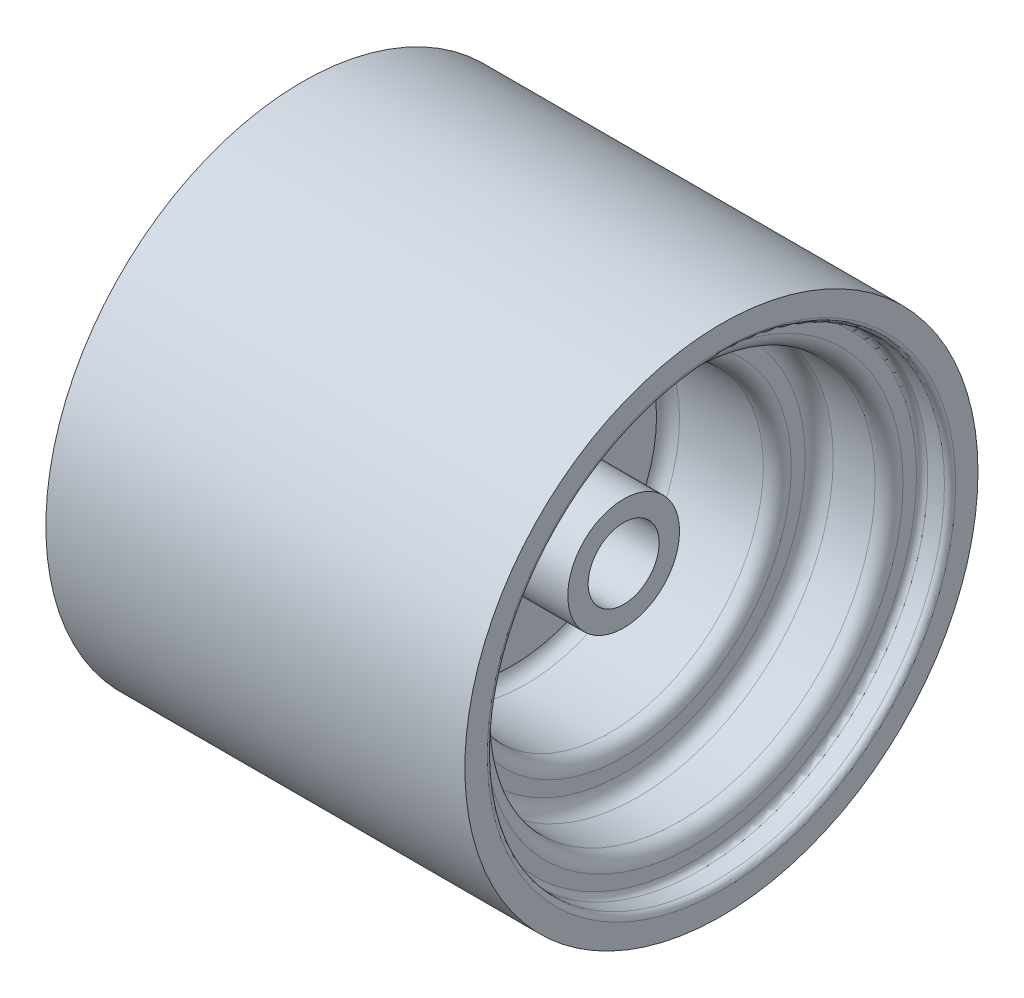
ISO-10303-21;
HEADER;
FILE_DESCRIPTION(('STEP AP214'),'2;1');
FILE_NAME('part.step','',(''),(''),'','','');
FILE_SCHEMA(('AUTOMOTIVE_DESIGN { 1 0 10303 214 1 1 1 1 }'));
ENDSEC;
DATA;
#1=APPLICATION_CONTEXT('core data for automotive mechanical design processes');
#2=APPLICATION_PROTOCOL_DEFINITION('international standard','automotive_design',2000,#1);
#3=PRODUCT_CONTEXT('',#1,'mechanical');
#4=PRODUCT('Part','Part','',(#3));
#5=PRODUCT_RELATED_PRODUCT_CATEGORY('part','',(#4));
#6=PRODUCT_DEFINITION_FORMATION('','',#4);
#7=PRODUCT_DEFINITION_CONTEXT('part definition',#1,'design');
#8=PRODUCT_DEFINITION('design','',#6,#7);
#9=PRODUCT_DEFINITION_SHAPE('','',#8);
#10=(LENGTH_UNIT() NAMED_UNIT(*) SI_UNIT(.MILLI.,.METRE.));
#11=(NAMED_UNIT(*) PLANE_ANGLE_UNIT() SI_UNIT($,.RADIAN.));
#12=(NAMED_UNIT(*) SI_UNIT($,.STERADIAN.) SOLID_ANGLE_UNIT());
#13=UNCERTAINTY_MEASURE_WITH_UNIT(LENGTH_MEASURE(1.E-05),#10,'distance_accuracy_value','');
#14=(GEOMETRIC_REPRESENTATION_CONTEXT(3) GLOBAL_UNCERTAINTY_ASSIGNED_CONTEXT((#13)) GLOBAL_UNIT_ASSIGNED_CONTEXT((#10,
#11,#12)) REPRESENTATION_CONTEXT('',''));
#15=CARTESIAN_POINT('',(0.,0.,0.));
#16=DIRECTION('',(0.,0.,1.));
#17=DIRECTION('',(1.,0.,0.));
#18=AXIS2_PLACEMENT_3D('',#15,#16,#17);
#19=CARTESIAN_POINT('',(150.24,0.,0.));
#20=DIRECTION('',(-1.,0.,0.));
#21=DIRECTION('',(0.,0.,1.));
#22=AXIS2_PLACEMENT_3D('',#19,#20,#21);
#23=CYLINDRICAL_SURFACE('',#22,91.845);
#24=CARTESIAN_POINT('',(150.24,0.,0.));
#25=DIRECTION('',(1.,0.,0.));
#26=DIRECTION('',(0.,0.,-1.));
#27=AXIS2_PLACEMENT_3D('',#24,#25,#26);
#28=CIRCLE('',#27,91.845);
#29=CARTESIAN_POINT('',(150.24,0.,-91.845));
#30=VERTEX_POINT('',#29);
#31=EDGE_CURVE('E75',#30,#30,#28,.T.);
#32=ORIENTED_EDGE('',*,*,#31,.F.);
#33=EDGE_LOOP('',(#32));
#34=FACE_BOUND('',#33,.T.);
#35=CARTESIAN_POINT('',(0.239999999999962,0.,0.));
#36=DIRECTION('',(1.,0.,0.));
#37=DIRECTION('',(0.,0.,-1.));
#38=AXIS2_PLACEMENT_3D('',#35,#36,#37);
#39=CIRCLE('',#38,91.845);
#40=CARTESIAN_POINT('',(0.239999999999962,0.,-91.845));
#41=VERTEX_POINT('',#40);
#42=EDGE_CURVE('E132',#41,#41,#39,.T.);
#43=ORIENTED_EDGE('',*,*,#42,.T.);
#44=EDGE_LOOP('',(#43));
#45=FACE_BOUND('',#44,.T.);
#46=ADVANCED_FACE('F31',(#34,#45),#23,.T.);
#47=CARTESIAN_POINT('',(150.24,0.,0.));
#48=DIRECTION('',(1.,0.,0.));
#49=DIRECTION('',(0.,0.,-1.));
#50=AXIS2_PLACEMENT_3D('',#47,#48,#49);
#51=PLANE('',#50);
#52=CARTESIAN_POINT('',(150.24,0.,0.));
#53=DIRECTION('',(1.,0.,0.));
#54=DIRECTION('',(0.,0.,-1.));
#55=AXIS2_PLACEMENT_3D('',#52,#53,#54);
#56=CIRCLE('',#55,83.845);
#57=CARTESIAN_POINT('',(150.24,0.,-83.845));
#58=VERTEX_POINT('',#57);
#59=EDGE_CURVE('E69',#58,#58,#56,.F.);
#60=ORIENTED_EDGE('',*,*,#59,.T.);
#61=EDGE_LOOP('',(#60));
#62=FACE_BOUND('',#61,.T.);
#63=ORIENTED_EDGE('',*,*,#31,.T.);
#64=EDGE_LOOP('',(#63));
#65=FACE_BOUND('',#64,.T.);
#66=ADVANCED_FACE('F164',(#62,#65),#51,.T.);
#67=CARTESIAN_POINT('',(140.24,0.,0.));
#68=DIRECTION('',(1.,0.,0.));
#69=DIRECTION('',(0.,0.,-1.));
#70=AXIS2_PLACEMENT_3D('',#67,#68,#69);
#71=CYLINDRICAL_SURFACE('',#70,81.845);
#72=CARTESIAN_POINT('',(142.24,0.,0.));
#73=DIRECTION('',(1.,0.,0.));
#74=DIRECTION('',(0.,0.,-1.));
#75=AXIS2_PLACEMENT_3D('',#72,#73,#74);
#76=CIRCLE('',#75,81.845);
#77=CARTESIAN_POINT('',(142.24,0.,-81.845));
#78=VERTEX_POINT('',#77);
#79=EDGE_CURVE('E51',#78,#78,#76,.F.);
#80=ORIENTED_EDGE('',*,*,#79,.T.);
#81=EDGE_LOOP('',(#80));
#82=FACE_BOUND('',#81,.T.);
#83=CARTESIAN_POINT('',(148.24,0.,0.));
#84=DIRECTION('',(1.,0.,0.));
#85=DIRECTION('',(0.,0.,-1.));
#86=AXIS2_PLACEMENT_3D('',#83,#84,#85);
#87=CIRCLE('',#86,81.845);
#88=CARTESIAN_POINT('',(148.24,0.,-81.845));
#89=VERTEX_POINT('',#88);
#90=EDGE_CURVE('E72',#89,#89,#87,.T.);
#91=ORIENTED_EDGE('',*,*,#90,.T.);
#92=EDGE_LOOP('',(#91));
#93=FACE_BOUND('',#92,.T.);
#94=ADVANCED_FACE('F170',(#82,#93),#71,.F.);
#95=CARTESIAN_POINT('',(140.24,0.,0.));
#96=DIRECTION('',(1.,0.,0.));
#97=DIRECTION('',(0.,0.,-1.));
#98=AXIS2_PLACEMENT_3D('',#95,#96,#97);
#99=PLANE('',#98);
#100=CARTESIAN_POINT('',(140.24,0.,0.));
#101=DIRECTION('',(1.,0.,0.));
#102=DIRECTION('',(0.,0.,-1.));
#103=AXIS2_PLACEMENT_3D('',#100,#101,#102);
#104=CIRCLE('',#103,79.845);
#105=CARTESIAN_POINT('',(140.24,0.,-79.845));
#106=VERTEX_POINT('',#105);
#107=EDGE_CURVE('E54',#106,#106,#104,.T.);
#108=ORIENTED_EDGE('',*,*,#107,.T.);
#109=EDGE_LOOP('',(#108));
#110=FACE_BOUND('',#109,.T.);
#111=CARTESIAN_POINT('',(140.24,0.,0.));
#112=DIRECTION('',(1.,0.,0.));
#113=DIRECTION('',(0.,0.,-1.));
#114=AXIS2_PLACEMENT_3D('',#111,#112,#113);
#115=CIRCLE('',#114,75.);
#116=CARTESIAN_POINT('',(140.24,0.,-75.));
#117=VERTEX_POINT('',#116);
#118=EDGE_CURVE('E63',#117,#117,#115,.F.);
#119=ORIENTED_EDGE('',*,*,#118,.T.);
#120=EDGE_LOOP('',(#119));
#121=FACE_BOUND('',#120,.T.);
#122=ADVANCED_FACE('F295',(#110,#121),#99,.T.);
#123=CARTESIAN_POINT('',(115.24,0.,0.));
#124=DIRECTION('',(1.,0.,0.));
#125=DIRECTION('',(0.,0.,-1.));
#126=AXIS2_PLACEMENT_3D('',#123,#124,#125);
#127=CYLINDRICAL_SURFACE('',#126,70.);
#128=CARTESIAN_POINT('',(120.24,0.,0.));
#129=DIRECTION('',(1.,0.,0.));
#130=DIRECTION('',(0.,0.,-1.));
#131=AXIS2_PLACEMENT_3D('',#128,#129,#130);
#132=CIRCLE('',#131,70.);
#133=CARTESIAN_POINT('',(120.24,0.,-70.));
#134=VERTEX_POINT('',#133);
#135=EDGE_CURVE('E57',#134,#134,#132,.F.);
#136=ORIENTED_EDGE('',*,*,#135,.T.);
#137=EDGE_LOOP('',(#136));
#138=FACE_BOUND('',#137,.T.);
#139=CARTESIAN_POINT('',(135.24,0.,0.));
#140=DIRECTION('',(1.,0.,0.));
#141=DIRECTION('',(0.,0.,-1.));
#142=AXIS2_PLACEMENT_3D('',#139,#140,#141);
#143=CIRCLE('',#142,70.);
#144=CARTESIAN_POINT('',(135.24,0.,-70.));
#145=VERTEX_POINT('',#144);
#146=EDGE_CURVE('E66',#145,#145,#143,.T.);
#147=ORIENTED_EDGE('',*,*,#146,.T.);
#148=EDGE_LOOP('',(#147));
#149=FACE_BOUND('',#148,.T.);
#150=ADVANCED_FACE('F291',(#138,#149),#127,.F.);
#151=CARTESIAN_POINT('',(115.24,0.,0.));
#152=DIRECTION('',(1.,0.,0.));
#153=DIRECTION('',(0.,0.,-1.));
#154=AXIS2_PLACEMENT_3D('',#151,#152,#153);
#155=PLANE('',#154);
#156=CARTESIAN_POINT('',(115.24,0.,0.));
#157=DIRECTION('',(1.,0.,0.));
#158=DIRECTION('',(0.,0.,-1.));
#159=AXIS2_PLACEMENT_3D('',#156,#157,#158);
#160=CIRCLE('',#159,60.);
#161=CARTESIAN_POINT('',(115.24,0.,-60.));
#162=VERTEX_POINT('',#161);
#163=EDGE_CURVE('E42',#162,#162,#160,.F.);
#164=ORIENTED_EDGE('',*,*,#163,.T.);
#165=EDGE_LOOP('',(#164));
#166=FACE_BOUND('',#165,.T.);
#167=CARTESIAN_POINT('',(115.24,0.,0.));
#168=DIRECTION('',(1.,0.,0.));
#169=DIRECTION('',(0.,0.,-1.));
#170=AXIS2_PLACEMENT_3D('',#167,#168,#169);
#171=CIRCLE('',#170,65.);
#172=CARTESIAN_POINT('',(115.24,0.,-65.));
#173=VERTEX_POINT('',#172);
#174=EDGE_CURVE('E60',#173,#173,#171,.T.);
#175=ORIENTED_EDGE('',*,*,#174,.T.);
#176=EDGE_LOOP('',(#175));
#177=FACE_BOUND('',#176,.T.);
#178=ADVANCED_FACE('F288',(#166,#177),#155,.T.);
#179=CARTESIAN_POINT('',(75.24,0.,0.));
#180=DIRECTION('',(1.,0.,0.));
#181=DIRECTION('',(0.,0.,-1.));
#182=AXIS2_PLACEMENT_3D('',#179,#180,#181);
#183=CYLINDRICAL_SURFACE('',#182,55.);
#184=CARTESIAN_POINT('',(80.24,0.,0.));
#185=DIRECTION('',(1.,0.,0.));
#186=DIRECTION('',(0.,0.,-1.));
#187=AXIS2_PLACEMENT_3D('',#184,#185,#186);
#188=CIRCLE('',#187,55.);
#189=CARTESIAN_POINT('',(80.24,0.,-55.));
#190=VERTEX_POINT('',#189);
#191=EDGE_CURVE('E38',#190,#190,#188,.F.);
#192=ORIENTED_EDGE('',*,*,#191,.T.);
#193=EDGE_LOOP('',(#192));
#194=FACE_BOUND('',#193,.T.);
#195=CARTESIAN_POINT('',(110.24,0.,0.));
#196=DIRECTION('',(1.,0.,0.));
#197=DIRECTION('',(0.,0.,-1.));
#198=AXIS2_PLACEMENT_3D('',#195,#196,#197);
#199=CIRCLE('',#198,55.);
#200=CARTESIAN_POINT('',(110.24,0.,-55.));
#201=VERTEX_POINT('',#200);
#202=EDGE_CURVE('E46',#201,#201,#199,.T.);
#203=ORIENTED_EDGE('',*,*,#202,.T.);
#204=EDGE_LOOP('',(#203));
#205=FACE_BOUND('',#204,.T.);
#206=ADVANCED_FACE('F181',(#194,#205),#183,.F.);
#207=CARTESIAN_POINT('',(148.24,0.,0.));
#208=DIRECTION('',(1.,0.,0.));
#209=DIRECTION('',(0.,0.,-1.));
#210=AXIS2_PLACEMENT_3D('',#207,#208,#209);
#211=TOROIDAL_SURFACE('',#210,83.845,2.);
#212=ORIENTED_EDGE('',*,*,#59,.F.);
#213=EDGE_LOOP('',(#212));
#214=FACE_BOUND('',#213,.T.);
#215=ORIENTED_EDGE('',*,*,#90,.F.);
#216=EDGE_LOOP('',(#215));
#217=FACE_BOUND('',#216,.T.);
#218=ADVANCED_FACE('F177',(#214,#217),#211,.T.);
#219=CARTESIAN_POINT('',(135.24,0.,0.));
#220=DIRECTION('',(1.,0.,0.));
#221=DIRECTION('',(0.,0.,-1.));
#222=AXIS2_PLACEMENT_3D('',#219,#220,#221);
#223=TOROIDAL_SURFACE('',#222,75.,5.);
#224=ORIENTED_EDGE('',*,*,#118,.F.);
#225=EDGE_LOOP('',(#224));
#226=FACE_BOUND('',#225,.T.);
#227=ORIENTED_EDGE('',*,*,#146,.F.);
#228=EDGE_LOOP('',(#227));
#229=FACE_BOUND('',#228,.T.);
#230=ADVANCED_FACE('F180',(#226,#229),#223,.T.);
#231=CARTESIAN_POINT('',(120.24,0.,0.));
#232=DIRECTION('',(1.,0.,0.));
#233=DIRECTION('',(0.,0.,-1.));
#234=AXIS2_PLACEMENT_3D('',#231,#232,#233);
#235=TOROIDAL_SURFACE('',#234,65.,5.);
#236=ORIENTED_EDGE('',*,*,#135,.F.);
#237=EDGE_LOOP('',(#236));
#238=FACE_BOUND('',#237,.T.);
#239=ORIENTED_EDGE('',*,*,#174,.F.);
#240=EDGE_LOOP('',(#239));
#241=FACE_BOUND('',#240,.T.);
#242=ADVANCED_FACE('F185',(#238,#241),#235,.F.);
#243=CARTESIAN_POINT('',(142.24,0.,0.));
#244=DIRECTION('',(1.,0.,0.));
#245=DIRECTION('',(0.,0.,-1.));
#246=AXIS2_PLACEMENT_3D('',#243,#244,#245);
#247=TOROIDAL_SURFACE('',#246,79.845,2.);
#248=ORIENTED_EDGE('',*,*,#79,.F.);
#249=EDGE_LOOP('',(#248));
#250=FACE_BOUND('',#249,.T.);
#251=ORIENTED_EDGE('',*,*,#107,.F.);
#252=EDGE_LOOP('',(#251));
#253=FACE_BOUND('',#252,.T.);
#254=ADVANCED_FACE('F189',(#250,#253),#247,.F.);
#255=CARTESIAN_POINT('',(110.24,0.,0.));
#256=DIRECTION('',(1.,0.,0.));
#257=DIRECTION('',(0.,0.,-1.));
#258=AXIS2_PLACEMENT_3D('',#255,#256,#257);
#259=TOROIDAL_SURFACE('',#258,60.,5.);
#260=ORIENTED_EDGE('',*,*,#163,.F.);
#261=EDGE_LOOP('',(#260));
#262=FACE_BOUND('',#261,.T.);
#263=ORIENTED_EDGE('',*,*,#202,.F.);
#264=EDGE_LOOP('',(#263));
#265=FACE_BOUND('',#264,.T.);
#266=ADVANCED_FACE('F193',(#262,#265),#259,.T.);
#267=CARTESIAN_POINT('',(80.24,0.,0.));
#268=DIRECTION('',(1.,0.,0.));
#269=DIRECTION('',(0.,0.,-1.));
#270=AXIS2_PLACEMENT_3D('',#267,#268,#269);
#271=TOROIDAL_SURFACE('',#270,50.,5.);
#272=CARTESIAN_POINT('',(75.48,0.,0.));
#273=DIRECTION('',(1.,0.,0.));
#274=DIRECTION('',(0.,0.,-1.));
#275=AXIS2_PLACEMENT_3D('',#272,#273,#274);
#276=CIRCLE('',#275,51.5304901175766);
#277=CARTESIAN_POINT('',(75.48,0.,-51.5304901175766));
#278=VERTEX_POINT('',#277);
#279=EDGE_CURVE('E90',#278,#278,#276,.F.);
#280=ORIENTED_EDGE('',*,*,#279,.T.);
#281=EDGE_LOOP('',(#280));
#282=FACE_BOUND('',#281,.T.);
#283=ORIENTED_EDGE('',*,*,#191,.F.);
#284=EDGE_LOOP('',(#283));
#285=FACE_BOUND('',#284,.T.);
#286=ADVANCED_FACE('F196',(#282,#285),#271,.F.);
#287=CARTESIAN_POINT('',(75.48,0.,0.));
#288=DIRECTION('',(1.,0.,0.));
#289=DIRECTION('',(0.,0.,1.));
#290=AXIS2_PLACEMENT_3D('',#287,#288,#289);
#291=PLANE('',#290);
#292=CARTESIAN_POINT('',(75.48,0.,0.));
#293=DIRECTION('',(-1.,0.,0.));
#294=DIRECTION('',(0.,0.,1.));
#295=AXIS2_PLACEMENT_3D('',#292,#293,#294);
#296=CIRCLE('',#295,21.050052633037);
#297=CARTESIAN_POINT('',(75.48,0.,21.050052633037));
#298=VERTEX_POINT('',#297);
#299=EDGE_CURVE('E93',#298,#298,#296,.F.);
#300=ORIENTED_EDGE('',*,*,#299,.F.);
#301=EDGE_LOOP('',(#300));
#302=FACE_BOUND('',#301,.T.);
#303=ORIENTED_EDGE('',*,*,#279,.F.);
#304=EDGE_LOOP('',(#303));
#305=FACE_BOUND('',#304,.T.);
#306=ADVANCED_FACE('F199',(#302,#305),#291,.T.);
#307=CARTESIAN_POINT('',(0.239999999999962,0.,0.));
#308=DIRECTION('',(-1.,0.,0.));
#309=DIRECTION('',(0.,0.,-1.));
#310=AXIS2_PLACEMENT_3D('',#307,#308,#309);
#311=PLANE('',#310);
#312=CARTESIAN_POINT('',(0.239999999999962,0.,0.));
#313=DIRECTION('',(1.,0.,0.));
#314=DIRECTION('',(0.,0.,-1.));
#315=AXIS2_PLACEMENT_3D('',#312,#313,#314);
#316=CIRCLE('',#315,83.845);
#317=CARTESIAN_POINT('',(0.239999999999962,0.,-83.845));
#318=VERTEX_POINT('',#317);
#319=EDGE_CURVE('E126',#318,#318,#316,.F.);
#320=ORIENTED_EDGE('',*,*,#319,.F.);
#321=EDGE_LOOP('',(#320));
#322=FACE_BOUND('',#321,.T.);
#323=ORIENTED_EDGE('',*,*,#42,.F.);
#324=EDGE_LOOP('',(#323));
#325=FACE_BOUND('',#324,.T.);
#326=ADVANCED_FACE('F204',(#322,#325),#311,.T.);
#327=CARTESIAN_POINT('',(10.24,0.,0.));
#328=DIRECTION('',(-1.,0.,0.));
#329=DIRECTION('',(0.,0.,-1.));
#330=AXIS2_PLACEMENT_3D('',#327,#328,#329);
#331=CYLINDRICAL_SURFACE('',#330,81.845);
#332=CARTESIAN_POINT('',(8.23999999999997,0.,0.));
#333=DIRECTION('',(1.,0.,0.));
#334=DIRECTION('',(0.,0.,-1.));
#335=AXIS2_PLACEMENT_3D('',#332,#333,#334);
#336=CIRCLE('',#335,81.845);
#337=CARTESIAN_POINT('',(8.23999999999997,0.,-81.845));
#338=VERTEX_POINT('',#337);
#339=EDGE_CURVE('E108',#338,#338,#336,.F.);
#340=ORIENTED_EDGE('',*,*,#339,.F.);
#341=EDGE_LOOP('',(#340));
#342=FACE_BOUND('',#341,.T.);
#343=CARTESIAN_POINT('',(2.23999999999996,0.,0.));
#344=DIRECTION('',(1.,0.,0.));
#345=DIRECTION('',(0.,0.,-1.));
#346=AXIS2_PLACEMENT_3D('',#343,#344,#345);
#347=CIRCLE('',#346,81.845);
#348=CARTESIAN_POINT('',(2.23999999999996,0.,-81.845));
#349=VERTEX_POINT('',#348);
#350=EDGE_CURVE('E129',#349,#349,#347,.T.);
#351=ORIENTED_EDGE('',*,*,#350,.F.);
#352=EDGE_LOOP('',(#351));
#353=FACE_BOUND('',#352,.T.);
#354=ADVANCED_FACE('F213',(#342,#353),#331,.F.);
#355=CARTESIAN_POINT('',(10.24,0.,0.));
#356=DIRECTION('',(-1.,0.,0.));
#357=DIRECTION('',(0.,0.,-1.));
#358=AXIS2_PLACEMENT_3D('',#355,#356,#357);
#359=PLANE('',#358);
#360=CARTESIAN_POINT('',(10.24,0.,0.));
#361=DIRECTION('',(1.,0.,0.));
#362=DIRECTION('',(0.,0.,-1.));
#363=AXIS2_PLACEMENT_3D('',#360,#361,#362);
#364=CIRCLE('',#363,79.845);
#365=CARTESIAN_POINT('',(10.24,0.,-79.845));
#366=VERTEX_POINT('',#365);
#367=EDGE_CURVE('E111',#366,#366,#364,.T.);
#368=ORIENTED_EDGE('',*,*,#367,.F.);
#369=EDGE_LOOP('',(#368));
#370=FACE_BOUND('',#369,.T.);
#371=CARTESIAN_POINT('',(10.24,0.,0.));
#372=DIRECTION('',(1.,0.,0.));
#373=DIRECTION('',(0.,0.,-1.));
#374=AXIS2_PLACEMENT_3D('',#371,#372,#373);
#375=CIRCLE('',#374,75.);
#376=CARTESIAN_POINT('',(10.24,0.,-75.));
#377=VERTEX_POINT('',#376);
#378=EDGE_CURVE('E120',#377,#377,#375,.F.);
#379=ORIENTED_EDGE('',*,*,#378,.F.);
#380=EDGE_LOOP('',(#379));
#381=FACE_BOUND('',#380,.T.);
#382=ADVANCED_FACE('F237',(#370,#381),#359,.T.);
#383=CARTESIAN_POINT('',(35.24,0.,0.));
#384=DIRECTION('',(-1.,0.,0.));
#385=DIRECTION('',(0.,0.,-1.));
#386=AXIS2_PLACEMENT_3D('',#383,#384,#385);
#387=CYLINDRICAL_SURFACE('',#386,70.);
#388=CARTESIAN_POINT('',(30.24,0.,0.));
#389=DIRECTION('',(1.,0.,0.));
#390=DIRECTION('',(0.,0.,-1.));
#391=AXIS2_PLACEMENT_3D('',#388,#389,#390);
#392=CIRCLE('',#391,70.);
#393=CARTESIAN_POINT('',(30.24,0.,-70.));
#394=VERTEX_POINT('',#393);
#395=EDGE_CURVE('E114',#394,#394,#392,.F.);
#396=ORIENTED_EDGE('',*,*,#395,.F.);
#397=EDGE_LOOP('',(#396));
#398=FACE_BOUND('',#397,.T.);
#399=CARTESIAN_POINT('',(15.24,0.,0.));
#400=DIRECTION('',(1.,0.,0.));
#401=DIRECTION('',(0.,0.,-1.));
#402=AXIS2_PLACEMENT_3D('',#399,#400,#401);
#403=CIRCLE('',#402,70.);
#404=CARTESIAN_POINT('',(15.24,0.,-70.));
#405=VERTEX_POINT('',#404);
#406=EDGE_CURVE('E123',#405,#405,#403,.T.);
#407=ORIENTED_EDGE('',*,*,#406,.F.);
#408=EDGE_LOOP('',(#407));
#409=FACE_BOUND('',#408,.T.);
#410=ADVANCED_FACE('F233',(#398,#409),#387,.F.);
#411=CARTESIAN_POINT('',(35.24,0.,0.));
#412=DIRECTION('',(-1.,0.,0.));
#413=DIRECTION('',(0.,0.,-1.));
#414=AXIS2_PLACEMENT_3D('',#411,#412,#413);
#415=PLANE('',#414);
#416=CARTESIAN_POINT('',(35.24,0.,0.));
#417=DIRECTION('',(1.,0.,0.));
#418=DIRECTION('',(0.,0.,-1.));
#419=AXIS2_PLACEMENT_3D('',#416,#417,#418);
#420=CIRCLE('',#419,60.);
#421=CARTESIAN_POINT('',(35.24,0.,-60.));
#422=VERTEX_POINT('',#421);
#423=EDGE_CURVE('E102',#422,#422,#420,.F.);
#424=ORIENTED_EDGE('',*,*,#423,.F.);
#425=EDGE_LOOP('',(#424));
#426=FACE_BOUND('',#425,.T.);
#427=CARTESIAN_POINT('',(35.24,0.,0.));
#428=DIRECTION('',(1.,0.,0.));
#429=DIRECTION('',(0.,0.,-1.));
#430=AXIS2_PLACEMENT_3D('',#427,#428,#429);
#431=CIRCLE('',#430,65.);
#432=CARTESIAN_POINT('',(35.24,0.,-65.));
#433=VERTEX_POINT('',#432);
#434=EDGE_CURVE('E117',#433,#433,#431,.T.);
#435=ORIENTED_EDGE('',*,*,#434,.F.);
#436=EDGE_LOOP('',(#435));
#437=FACE_BOUND('',#436,.T.);
#438=ADVANCED_FACE('F229',(#426,#437),#415,.T.);
#439=CARTESIAN_POINT('',(75.24,0.,0.));
#440=DIRECTION('',(-1.,0.,0.));
#441=DIRECTION('',(0.,0.,-1.));
#442=AXIS2_PLACEMENT_3D('',#439,#440,#441);
#443=CYLINDRICAL_SURFACE('',#442,55.);
#444=CARTESIAN_POINT('',(70.24,0.,0.));
#445=DIRECTION('',(1.,0.,0.));
#446=DIRECTION('',(0.,0.,-1.));
#447=AXIS2_PLACEMENT_3D('',#444,#445,#446);
#448=CIRCLE('',#447,55.);
#449=CARTESIAN_POINT('',(70.24,0.,-55.));
#450=VERTEX_POINT('',#449);
#451=EDGE_CURVE('E99',#450,#450,#448,.F.);
#452=ORIENTED_EDGE('',*,*,#451,.F.);
#453=EDGE_LOOP('',(#452));
#454=FACE_BOUND('',#453,.T.);
#455=CARTESIAN_POINT('',(40.24,0.,0.));
#456=DIRECTION('',(1.,0.,0.));
#457=DIRECTION('',(0.,0.,-1.));
#458=AXIS2_PLACEMENT_3D('',#455,#456,#457);
#459=CIRCLE('',#458,55.);
#460=CARTESIAN_POINT('',(40.24,0.,-55.));
#461=VERTEX_POINT('',#460);
#462=EDGE_CURVE('E105',#461,#461,#459,.T.);
#463=ORIENTED_EDGE('',*,*,#462,.F.);
#464=EDGE_LOOP('',(#463));
#465=FACE_BOUND('',#464,.T.);
#466=ADVANCED_FACE('F225',(#454,#465),#443,.F.);
#467=CARTESIAN_POINT('',(2.23999999999996,0.,0.));
#468=DIRECTION('',(-1.,0.,0.));
#469=DIRECTION('',(0.,0.,-1.));
#470=AXIS2_PLACEMENT_3D('',#467,#468,#469);
#471=TOROIDAL_SURFACE('',#470,83.845,2.);
#472=ORIENTED_EDGE('',*,*,#319,.T.);
#473=EDGE_LOOP('',(#472));
#474=FACE_BOUND('',#473,.T.);
#475=ORIENTED_EDGE('',*,*,#350,.T.);
#476=EDGE_LOOP('',(#475));
#477=FACE_BOUND('',#476,.T.);
#478=ADVANCED_FACE('F228',(#474,#477),#471,.T.);
#479=CARTESIAN_POINT('',(15.24,0.,0.));
#480=DIRECTION('',(-1.,0.,0.));
#481=DIRECTION('',(0.,0.,-1.));
#482=AXIS2_PLACEMENT_3D('',#479,#480,#481);
#483=TOROIDAL_SURFACE('',#482,75.,5.);
#484=ORIENTED_EDGE('',*,*,#378,.T.);
#485=EDGE_LOOP('',(#484));
#486=FACE_BOUND('',#485,.T.);
#487=ORIENTED_EDGE('',*,*,#406,.T.);
#488=EDGE_LOOP('',(#487));
#489=FACE_BOUND('',#488,.T.);
#490=ADVANCED_FACE('F247',(#486,#489),#483,.T.);
#491=CARTESIAN_POINT('',(30.24,0.,0.));
#492=DIRECTION('',(-1.,0.,0.));
#493=DIRECTION('',(0.,0.,-1.));
#494=AXIS2_PLACEMENT_3D('',#491,#492,#493);
#495=TOROIDAL_SURFACE('',#494,65.,5.);
#496=ORIENTED_EDGE('',*,*,#395,.T.);
#497=EDGE_LOOP('',(#496));
#498=FACE_BOUND('',#497,.T.);
#499=ORIENTED_EDGE('',*,*,#434,.T.);
#500=EDGE_LOOP('',(#499));
#501=FACE_BOUND('',#500,.T.);
#502=ADVANCED_FACE('F251',(#498,#501),#495,.F.);
#503=CARTESIAN_POINT('',(8.23999999999997,0.,0.));
#504=DIRECTION('',(-1.,0.,0.));
#505=DIRECTION('',(0.,0.,-1.));
#506=AXIS2_PLACEMENT_3D('',#503,#504,#505);
#507=TOROIDAL_SURFACE('',#506,79.845,2.);
#508=ORIENTED_EDGE('',*,*,#339,.T.);
#509=EDGE_LOOP('',(#508));
#510=FACE_BOUND('',#509,.T.);
#511=ORIENTED_EDGE('',*,*,#367,.T.);
#512=EDGE_LOOP('',(#511));
#513=FACE_BOUND('',#512,.T.);
#514=ADVANCED_FACE('F255',(#510,#513),#507,.F.);
#515=CARTESIAN_POINT('',(40.24,0.,0.));
#516=DIRECTION('',(-1.,0.,0.));
#517=DIRECTION('',(0.,0.,-1.));
#518=AXIS2_PLACEMENT_3D('',#515,#516,#517);
#519=TOROIDAL_SURFACE('',#518,60.,5.);
#520=ORIENTED_EDGE('',*,*,#423,.T.);
#521=EDGE_LOOP('',(#520));
#522=FACE_BOUND('',#521,.T.);
#523=ORIENTED_EDGE('',*,*,#462,.T.);
#524=EDGE_LOOP('',(#523));
#525=FACE_BOUND('',#524,.T.);
#526=ADVANCED_FACE('F158',(#522,#525),#519,.T.);
#527=CARTESIAN_POINT('',(70.24,0.,0.));
#528=DIRECTION('',(-1.,0.,0.));
#529=DIRECTION('',(0.,0.,-1.));
#530=AXIS2_PLACEMENT_3D('',#527,#528,#529);
#531=TOROIDAL_SURFACE('',#530,50.,5.);
#532=CARTESIAN_POINT('',(75.,0.,0.));
#533=DIRECTION('',(-1.,0.,0.));
#534=DIRECTION('',(0.,0.,1.));
#535=AXIS2_PLACEMENT_3D('',#532,#533,#534);
#536=CIRCLE('',#535,51.5304901175766);
#537=CARTESIAN_POINT('',(75.,0.,51.5304901175766));
#538=VERTEX_POINT('',#537);
#539=EDGE_CURVE('E84',#538,#538,#536,.T.);
#540=ORIENTED_EDGE('',*,*,#539,.F.);
#541=EDGE_LOOP('',(#540));
#542=FACE_BOUND('',#541,.T.);
#543=ORIENTED_EDGE('',*,*,#451,.T.);
#544=EDGE_LOOP('',(#543));
#545=FACE_BOUND('',#544,.T.);
#546=ADVANCED_FACE('F148',(#542,#545),#531,.F.);
#547=CARTESIAN_POINT('',(40.24,0.,0.));
#548=DIRECTION('',(1.,0.,0.));
#549=DIRECTION('',(0.,0.,-1.));
#550=AXIS2_PLACEMENT_3D('',#547,#548,#549);
#551=CYLINDRICAL_SURFACE('',#550,12.7);
#552=CARTESIAN_POINT('',(115.24,0.,0.));
#553=DIRECTION('',(1.,0.,0.));
#554=DIRECTION('',(0.,0.,-1.));
#555=AXIS2_PLACEMENT_3D('',#552,#553,#554);
#556=CIRCLE('',#555,12.7);
#557=CARTESIAN_POINT('',(115.24,0.,-12.7));
#558=VERTEX_POINT('',#557);
#559=EDGE_CURVE('E81',#558,#558,#556,.T.);
#560=ORIENTED_EDGE('',*,*,#559,.T.);
#561=EDGE_LOOP('',(#560));
#562=FACE_BOUND('',#561,.T.);
#563=CARTESIAN_POINT('',(35.24,0.,0.));
#564=DIRECTION('',(1.,0.,0.));
#565=DIRECTION('',(0.,0.,-1.));
#566=AXIS2_PLACEMENT_3D('',#563,#564,#565);
#567=CIRCLE('',#566,12.7);
#568=CARTESIAN_POINT('',(35.24,0.,-12.7));
#569=VERTEX_POINT('',#568);
#570=EDGE_CURVE('E138',#569,#569,#567,.T.);
#571=ORIENTED_EDGE('',*,*,#570,.F.);
#572=EDGE_LOOP('',(#571));
#573=FACE_BOUND('',#572,.T.);
#574=ADVANCED_FACE('F145',(#562,#573),#551,.F.);
#575=CARTESIAN_POINT('',(115.24,0.,0.));
#576=DIRECTION('',(1.,0.,0.));
#577=DIRECTION('',(0.,0.,-1.));
#578=AXIS2_PLACEMENT_3D('',#575,#576,#577);
#579=PLANE('',#578);
#580=ORIENTED_EDGE('',*,*,#559,.F.);
#581=EDGE_LOOP('',(#580));
#582=FACE_BOUND('',#581,.T.);
#583=CARTESIAN_POINT('',(115.24,0.,0.));
#584=DIRECTION('',(1.,0.,0.));
#585=DIRECTION('',(0.,0.,-1.));
#586=AXIS2_PLACEMENT_3D('',#583,#584,#585);
#587=CIRCLE('',#586,20.);
#588=CARTESIAN_POINT('',(115.24,0.,-20.));
#589=VERTEX_POINT('',#588);
#590=EDGE_CURVE('E78',#589,#589,#587,.T.);
#591=ORIENTED_EDGE('',*,*,#590,.T.);
#592=EDGE_LOOP('',(#591));
#593=FACE_BOUND('',#592,.T.);
#594=ADVANCED_FACE('F147',(#582,#593),#579,.T.);
#595=CARTESIAN_POINT('',(115.24,0.,0.));
#596=DIRECTION('',(-1.,0.,0.));
#597=DIRECTION('',(0.,0.,1.));
#598=AXIS2_PLACEMENT_3D('',#595,#596,#597);
#599=CYLINDRICAL_SURFACE('',#598,20.);
#600=CARTESIAN_POINT('',(77.24,0.,0.));
#601=DIRECTION('',(1.,0.,0.));
#602=DIRECTION('',(0.,0.,-1.));
#603=AXIS2_PLACEMENT_3D('',#600,#601,#602);
#604=CIRCLE('',#603,20.);
#605=CARTESIAN_POINT('',(77.24,0.,-20.));
#606=VERTEX_POINT('',#605);
#607=EDGE_CURVE('E10',#606,#606,#604,.T.);
#608=ORIENTED_EDGE('',*,*,#607,.T.);
#609=EDGE_LOOP('',(#608));
#610=FACE_BOUND('',#609,.T.);
#611=ORIENTED_EDGE('',*,*,#590,.F.);
#612=EDGE_LOOP('',(#611));
#613=FACE_BOUND('',#612,.T.);
#614=ADVANCED_FACE('F155',(#610,#613),#599,.T.);
#615=CARTESIAN_POINT('',(77.24,0.,0.));
#616=DIRECTION('',(1.,0.,0.));
#617=DIRECTION('',(0.,0.,-1.));
#618=AXIS2_PLACEMENT_3D('',#615,#616,#617);
#619=TOROIDAL_SURFACE('',#618,22.,2.);
#620=ORIENTED_EDGE('',*,*,#299,.T.);
#621=EDGE_LOOP('',(#620));
#622=FACE_BOUND('',#621,.T.);
#623=ORIENTED_EDGE('',*,*,#607,.F.);
#624=EDGE_LOOP('',(#623));
#625=FACE_BOUND('',#624,.T.);
#626=ADVANCED_FACE('F33',(#622,#625),#619,.F.);
#627=CARTESIAN_POINT('',(35.24,0.,0.));
#628=DIRECTION('',(-1.,0.,0.));
#629=DIRECTION('',(0.,0.,-1.));
#630=AXIS2_PLACEMENT_3D('',#627,#628,#629);
#631=PLANE('',#630);
#632=ORIENTED_EDGE('',*,*,#570,.T.);
#633=EDGE_LOOP('',(#632));
#634=FACE_BOUND('',#633,.T.);
#635=CARTESIAN_POINT('',(35.24,0.,0.));
#636=DIRECTION('',(1.,0.,0.));
#637=DIRECTION('',(0.,0.,-1.));
#638=AXIS2_PLACEMENT_3D('',#635,#636,#637);
#639=CIRCLE('',#638,20.);
#640=CARTESIAN_POINT('',(35.24,0.,-20.));
#641=VERTEX_POINT('',#640);
#642=EDGE_CURVE('E135',#641,#641,#639,.T.);
#643=ORIENTED_EDGE('',*,*,#642,.F.);
#644=EDGE_LOOP('',(#643));
#645=FACE_BOUND('',#644,.T.);
#646=ADVANCED_FACE('F142',(#634,#645),#631,.T.);
#647=CARTESIAN_POINT('',(35.24,0.,0.));
#648=DIRECTION('',(1.,0.,0.));
#649=DIRECTION('',(0.,0.,1.));
#650=AXIS2_PLACEMENT_3D('',#647,#648,#649);
#651=CYLINDRICAL_SURFACE('',#650,20.);
#652=CARTESIAN_POINT('',(73.24,0.,0.));
#653=DIRECTION('',(1.,0.,0.));
#654=DIRECTION('',(0.,0.,-1.));
#655=AXIS2_PLACEMENT_3D('',#652,#653,#654);
#656=CIRCLE('',#655,20.);
#657=CARTESIAN_POINT('',(73.24,0.,-20.));
#658=VERTEX_POINT('',#657);
#659=EDGE_CURVE('E96',#658,#658,#656,.T.);
#660=ORIENTED_EDGE('',*,*,#659,.F.);
#661=EDGE_LOOP('',(#660));
#662=FACE_BOUND('',#661,.T.);
#663=ORIENTED_EDGE('',*,*,#642,.T.);
#664=EDGE_LOOP('',(#663));
#665=FACE_BOUND('',#664,.T.);
#666=ADVANCED_FACE('F220',(#662,#665),#651,.T.);
#667=CARTESIAN_POINT('',(73.24,0.,0.));
#668=DIRECTION('',(-1.,0.,0.));
#669=DIRECTION('',(0.,0.,-1.));
#670=AXIS2_PLACEMENT_3D('',#667,#668,#669);
#671=TOROIDAL_SURFACE('',#670,22.,2.);
#672=CARTESIAN_POINT('',(75.,0.,0.));
#673=DIRECTION('',(1.,0.,0.));
#674=DIRECTION('',(0.,0.,-1.));
#675=AXIS2_PLACEMENT_3D('',#672,#673,#674);
#676=CIRCLE('',#675,21.050052633037);
#677=CARTESIAN_POINT('',(75.,0.,-21.050052633037));
#678=VERTEX_POINT('',#677);
#679=EDGE_CURVE('E87',#678,#678,#676,.T.);
#680=ORIENTED_EDGE('',*,*,#679,.F.);
#681=EDGE_LOOP('',(#680));
#682=FACE_BOUND('',#681,.T.);
#683=ORIENTED_EDGE('',*,*,#659,.T.);
#684=EDGE_LOOP('',(#683));
#685=FACE_BOUND('',#684,.T.);
#686=ADVANCED_FACE('F223',(#682,#685),#671,.F.);
#687=CARTESIAN_POINT('',(75.,0.,0.));
#688=DIRECTION('',(-1.,0.,0.));
#689=DIRECTION('',(0.,0.,1.));
#690=AXIS2_PLACEMENT_3D('',#687,#688,#689);
#691=PLANE('',#690);
#692=ORIENTED_EDGE('',*,*,#679,.T.);
#693=EDGE_LOOP('',(#692));
#694=FACE_BOUND('',#693,.T.);
#695=ORIENTED_EDGE('',*,*,#539,.T.);
#696=EDGE_LOOP('',(#695));
#697=FACE_BOUND('',#696,.T.);
#698=ADVANCED_FACE('F263',(#694,#697),#691,.T.);
#699=CLOSED_SHELL('',(#46,#66,#94,#122,#150,#178,#206,#218,#230,#242,#254,#266,#286,#306,#326,
#354,#382,#410,#438,#466,#478,#490,#502,#514,#526,#546,#574,#594,#614,#626,#646,#666,#686,#698));
#700=MANIFOLD_SOLID_BREP('B2',#699);
#701=ADVANCED_BREP_SHAPE_REPRESENTATION('',(#18,#700),#14);
#702=SHAPE_DEFINITION_REPRESENTATION(#9,#701);
ENDSEC;
END-ISO-10303-21;
